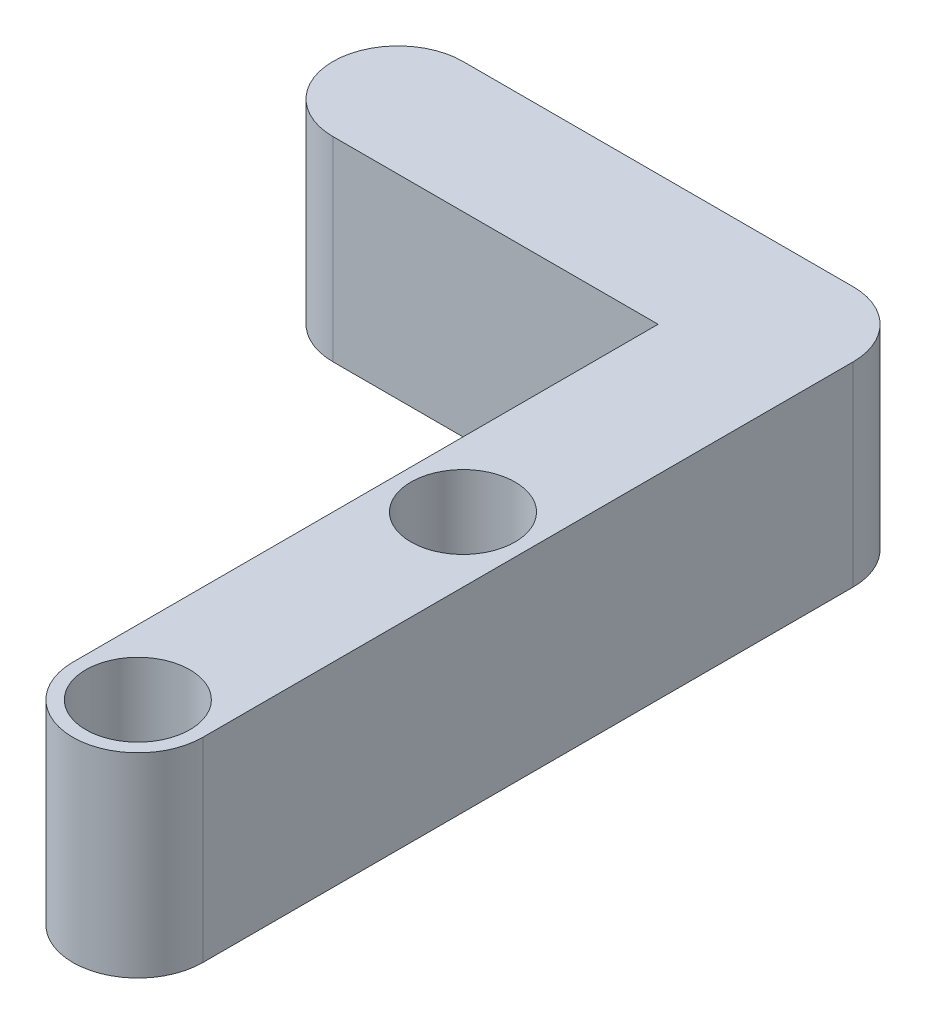
ISO-10303-21;
HEADER;
FILE_DESCRIPTION(('STEP AP214'),'2;1');
FILE_NAME('part.step','',(''),(''),'','','');
FILE_SCHEMA(('AUTOMOTIVE_DESIGN { 1 0 10303 214 1 1 1 1 }'));
ENDSEC;
DATA;
#1=APPLICATION_CONTEXT('core data for automotive mechanical design processes');
#2=APPLICATION_PROTOCOL_DEFINITION('international standard','automotive_design',2000,#1);
#3=PRODUCT_CONTEXT('',#1,'mechanical');
#4=PRODUCT('Part','Part','',(#3));
#5=PRODUCT_RELATED_PRODUCT_CATEGORY('part','',(#4));
#6=PRODUCT_DEFINITION_FORMATION('','',#4);
#7=PRODUCT_DEFINITION_CONTEXT('part definition',#1,'design');
#8=PRODUCT_DEFINITION('design','',#6,#7);
#9=PRODUCT_DEFINITION_SHAPE('','',#8);
#10=(LENGTH_UNIT() NAMED_UNIT(*) SI_UNIT(.MILLI.,.METRE.));
#11=(NAMED_UNIT(*) PLANE_ANGLE_UNIT() SI_UNIT($,.RADIAN.));
#12=(NAMED_UNIT(*) SI_UNIT($,.STERADIAN.) SOLID_ANGLE_UNIT());
#13=UNCERTAINTY_MEASURE_WITH_UNIT(LENGTH_MEASURE(1.E-05),#10,'distance_accuracy_value','');
#14=(GEOMETRIC_REPRESENTATION_CONTEXT(3) GLOBAL_UNCERTAINTY_ASSIGNED_CONTEXT((#13)) GLOBAL_UNIT_ASSIGNED_CONTEXT((#10,
#11,#12)) REPRESENTATION_CONTEXT('',''));
#15=CARTESIAN_POINT('',(0.,0.,0.));
#16=DIRECTION('',(0.,0.,1.));
#17=DIRECTION('',(1.,0.,0.));
#18=AXIS2_PLACEMENT_3D('',#15,#16,#17);
#19=CARTESIAN_POINT('',(-38.1229462191063,1.5,0.));
#20=DIRECTION('',(1.,0.,0.));
#21=DIRECTION('',(0.,0.,-1.));
#22=AXIS2_PLACEMENT_3D('',#19,#20,#21);
#23=PLANE('',#22);
#24=DIRECTION('',(0.,0.,1.));
#25=VECTOR('',#24,1.);
#26=CARTESIAN_POINT('',(-38.1229462191063,0.,0.));
#27=LINE('',#26,#25);
#28=CARTESIAN_POINT('',(-38.1229462191063,0.,14.3635639466581));
#29=VERTEX_POINT('',#28);
#30=CARTESIAN_POINT('',(-38.1229462191063,0.,19.3635639466581));
#31=VERTEX_POINT('',#30);
#32=EDGE_CURVE('E144',#29,#31,#27,.T.);
#33=ORIENTED_EDGE('',*,*,#32,.F.);
#34=DIRECTION('',(0.,-1.,0.));
#35=VECTOR('',#34,1.);
#36=CARTESIAN_POINT('',(-38.1229462191063,1.5,14.3635639466581));
#37=LINE('',#36,#35);
#38=CARTESIAN_POINT('',(-38.1229462191063,1.5,14.3635639466581));
#39=VERTEX_POINT('',#38);
#40=EDGE_CURVE('E11',#39,#29,#37,.T.);
#41=ORIENTED_EDGE('',*,*,#40,.F.);
#42=DIRECTION('',(0.,0.,1.));
#43=VECTOR('',#42,1.);
#44=CARTESIAN_POINT('',(-38.1229462191063,1.5,0.));
#45=LINE('',#44,#43);
#46=CARTESIAN_POINT('',(-38.1229462191063,1.5,19.3635639466581));
#47=VERTEX_POINT('',#46);
#48=EDGE_CURVE('E173',#39,#47,#45,.T.);
#49=ORIENTED_EDGE('',*,*,#48,.T.);
#50=DIRECTION('',(0.,-1.,0.));
#51=VECTOR('',#50,1.);
#52=CARTESIAN_POINT('',(-38.1229462191063,1.5,19.3635639466581));
#53=LINE('',#52,#51);
#54=EDGE_CURVE('E89',#47,#31,#53,.T.);
#55=ORIENTED_EDGE('',*,*,#54,.T.);
#56=EDGE_LOOP('',(#33,#41,#49,#55));
#57=FACE_BOUND('',#56,.T.);
#58=ADVANCED_FACE('F41',(#57),#23,.T.);
#59=CARTESIAN_POINT('',(-38.6229462191063,1.5,14.3635639466581));
#60=DIRECTION('',(0.,-1.,0.));
#61=DIRECTION('',(0.,0.,-1.));
#62=AXIS2_PLACEMENT_3D('',#59,#60,#61);
#63=CYLINDRICAL_SURFACE('',#62,0.5);
#64=CARTESIAN_POINT('',(-38.6229462191063,0.,14.3635639466581));
#65=DIRECTION('',(0.,1.,0.));
#66=DIRECTION('',(0.,0.,1.));
#67=AXIS2_PLACEMENT_3D('',#64,#65,#66);
#68=CIRCLE('',#67,0.5);
#69=CARTESIAN_POINT('',(-38.6229462191063,0.,13.8635639466581));
#70=VERTEX_POINT('',#69);
#71=EDGE_CURVE('E148',#29,#70,#68,.T.);
#72=ORIENTED_EDGE('',*,*,#71,.T.);
#73=DIRECTION('',(0.,-1.,0.));
#74=VECTOR('',#73,1.);
#75=CARTESIAN_POINT('',(-38.6229462191063,1.5,13.8635639466581));
#76=LINE('',#75,#74);
#77=CARTESIAN_POINT('',(-38.6229462191063,1.5,13.8635639466581));
#78=VERTEX_POINT('',#77);
#79=EDGE_CURVE('E50',#78,#70,#76,.T.);
#80=ORIENTED_EDGE('',*,*,#79,.F.);
#81=CARTESIAN_POINT('',(-38.6229462191063,1.5,14.3635639466581));
#82=DIRECTION('',(0.,1.,0.));
#83=DIRECTION('',(0.,0.,1.));
#84=AXIS2_PLACEMENT_3D('',#81,#82,#83);
#85=CIRCLE('',#84,0.5);
#86=EDGE_CURVE('E216',#39,#78,#85,.T.);
#87=ORIENTED_EDGE('',*,*,#86,.F.);
#88=ORIENTED_EDGE('',*,*,#40,.T.);
#89=EDGE_LOOP('',(#72,#80,#87,#88));
#90=FACE_BOUND('',#89,.T.);
#91=ADVANCED_FACE('F206',(#90),#63,.T.);
#92=CARTESIAN_POINT('',(0.,1.5,13.8635639466581));
#93=DIRECTION('',(0.,0.,1.));
#94=DIRECTION('',(1.,0.,0.));
#95=AXIS2_PLACEMENT_3D('',#92,#93,#94);
#96=PLANE('',#95);
#97=DIRECTION('',(-1.,0.,0.));
#98=VECTOR('',#97,1.);
#99=CARTESIAN_POINT('',(0.,0.,13.8635639466581));
#100=LINE('',#99,#98);
#101=CARTESIAN_POINT('',(-41.6229462191063,0.,13.8635639466581));
#102=VERTEX_POINT('',#101);
#103=EDGE_CURVE('E151',#70,#102,#100,.T.);
#104=ORIENTED_EDGE('',*,*,#103,.T.);
#105=DIRECTION('',(0.,-1.,0.));
#106=VECTOR('',#105,1.);
#107=CARTESIAN_POINT('',(-41.6229462191063,1.5,13.8635639466581));
#108=LINE('',#107,#106);
#109=CARTESIAN_POINT('',(-41.6229462191063,1.5,13.8635639466581));
#110=VERTEX_POINT('',#109);
#111=EDGE_CURVE('E180',#110,#102,#108,.T.);
#112=ORIENTED_EDGE('',*,*,#111,.F.);
#113=DIRECTION('',(-1.,0.,0.));
#114=VECTOR('',#113,1.);
#115=CARTESIAN_POINT('',(0.,1.5,13.8635639466581));
#116=LINE('',#115,#114);
#117=EDGE_CURVE('E130',#78,#110,#116,.T.);
#118=ORIENTED_EDGE('',*,*,#117,.F.);
#119=ORIENTED_EDGE('',*,*,#79,.T.);
#120=EDGE_LOOP('',(#104,#112,#118,#119));
#121=FACE_BOUND('',#120,.T.);
#122=ADVANCED_FACE('F189',(#121),#96,.F.);
#123=CARTESIAN_POINT('',(-41.6229462191063,1.5,14.3635639466581));
#124=DIRECTION('',(0.,-1.,0.));
#125=DIRECTION('',(0.,0.,-1.));
#126=AXIS2_PLACEMENT_3D('',#123,#124,#125);
#127=CYLINDRICAL_SURFACE('',#126,0.5);
#128=CARTESIAN_POINT('',(-41.6229462191063,0.,14.3635639466581));
#129=DIRECTION('',(0.,1.,0.));
#130=DIRECTION('',(0.,0.,1.));
#131=AXIS2_PLACEMENT_3D('',#128,#129,#130);
#132=CIRCLE('',#131,0.5);
#133=CARTESIAN_POINT('',(-41.6229462191063,0.,14.8635639466581));
#134=VERTEX_POINT('',#133);
#135=EDGE_CURVE('E154',#102,#134,#132,.T.);
#136=ORIENTED_EDGE('',*,*,#135,.T.);
#137=DIRECTION('',(0.,-1.,0.));
#138=VECTOR('',#137,1.);
#139=CARTESIAN_POINT('',(-41.6229462191063,1.5,14.8635639466581));
#140=LINE('',#139,#138);
#141=CARTESIAN_POINT('',(-41.6229462191063,1.5,14.8635639466581));
#142=VERTEX_POINT('',#141);
#143=EDGE_CURVE('E115',#142,#134,#140,.T.);
#144=ORIENTED_EDGE('',*,*,#143,.F.);
#145=CARTESIAN_POINT('',(-41.6229462191063,1.5,14.3635639466581));
#146=DIRECTION('',(0.,1.,0.));
#147=DIRECTION('',(0.,0.,1.));
#148=AXIS2_PLACEMENT_3D('',#145,#146,#147);
#149=CIRCLE('',#148,0.5);
#150=EDGE_CURVE('E125',#110,#142,#149,.T.);
#151=ORIENTED_EDGE('',*,*,#150,.F.);
#152=ORIENTED_EDGE('',*,*,#111,.T.);
#153=EDGE_LOOP('',(#136,#144,#151,#152));
#154=FACE_BOUND('',#153,.T.);
#155=ADVANCED_FACE('F198',(#154),#127,.T.);
#156=CARTESIAN_POINT('',(0.,1.5,14.8635639466581));
#157=DIRECTION('',(0.,0.,1.));
#158=DIRECTION('',(1.,0.,0.));
#159=AXIS2_PLACEMENT_3D('',#156,#157,#158);
#160=PLANE('',#159);
#161=DIRECTION('',(-1.,0.,0.));
#162=VECTOR('',#161,1.);
#163=CARTESIAN_POINT('',(0.,0.,14.8635639466581));
#164=LINE('',#163,#162);
#165=CARTESIAN_POINT('',(-39.1229462191063,0.,14.8635639466581));
#166=VERTEX_POINT('',#165);
#167=EDGE_CURVE('E113',#166,#134,#164,.T.);
#168=ORIENTED_EDGE('',*,*,#167,.F.);
#169=DIRECTION('',(0.,-1.,0.));
#170=VECTOR('',#169,1.);
#171=CARTESIAN_POINT('',(-39.1229462191063,1.5,14.8635639466581));
#172=LINE('',#171,#170);
#173=CARTESIAN_POINT('',(-39.1229462191063,1.5,14.8635639466581));
#174=VERTEX_POINT('',#173);
#175=EDGE_CURVE('E107',#174,#166,#172,.T.);
#176=ORIENTED_EDGE('',*,*,#175,.F.);
#177=DIRECTION('',(-1.,0.,0.));
#178=VECTOR('',#177,1.);
#179=CARTESIAN_POINT('',(0.,1.5,14.8635639466581));
#180=LINE('',#179,#178);
#181=EDGE_CURVE('E111',#174,#142,#180,.T.);
#182=ORIENTED_EDGE('',*,*,#181,.T.);
#183=ORIENTED_EDGE('',*,*,#143,.T.);
#184=EDGE_LOOP('',(#168,#176,#182,#183));
#185=FACE_BOUND('',#184,.T.);
#186=ADVANCED_FACE('F109',(#185),#160,.T.);
#187=CARTESIAN_POINT('',(-39.1229462191063,1.5,0.));
#188=DIRECTION('',(1.,0.,0.));
#189=DIRECTION('',(0.,0.,-1.));
#190=AXIS2_PLACEMENT_3D('',#187,#188,#189);
#191=PLANE('',#190);
#192=DIRECTION('',(0.,0.,1.));
#193=VECTOR('',#192,1.);
#194=CARTESIAN_POINT('',(-39.1229462191063,0.,0.));
#195=LINE('',#194,#193);
#196=CARTESIAN_POINT('',(-39.1229462191063,0.,19.3635639466581));
#197=VERTEX_POINT('',#196);
#198=EDGE_CURVE('E82',#166,#197,#195,.T.);
#199=ORIENTED_EDGE('',*,*,#198,.T.);
#200=DIRECTION('',(0.,-1.,0.));
#201=VECTOR('',#200,1.);
#202=CARTESIAN_POINT('',(-39.1229462191063,1.5,19.3635639466581));
#203=LINE('',#202,#201);
#204=CARTESIAN_POINT('',(-39.1229462191063,1.5,19.3635639466581));
#205=VERTEX_POINT('',#204);
#206=EDGE_CURVE('E116',#205,#197,#203,.T.);
#207=ORIENTED_EDGE('',*,*,#206,.F.);
#208=DIRECTION('',(0.,0.,1.));
#209=VECTOR('',#208,1.);
#210=CARTESIAN_POINT('',(-39.1229462191063,1.5,0.));
#211=LINE('',#210,#209);
#212=EDGE_CURVE('E118',#174,#205,#211,.T.);
#213=ORIENTED_EDGE('',*,*,#212,.F.);
#214=ORIENTED_EDGE('',*,*,#175,.T.);
#215=EDGE_LOOP('',(#199,#207,#213,#214));
#216=FACE_BOUND('',#215,.T.);
#217=ADVANCED_FACE('F119',(#216),#191,.F.);
#218=CARTESIAN_POINT('',(-38.6229462191063,1.5,16.8635639466581));
#219=DIRECTION('',(0.,-1.,0.));
#220=DIRECTION('',(0.,0.,-1.));
#221=AXIS2_PLACEMENT_3D('',#218,#219,#220);
#222=CYLINDRICAL_SURFACE('',#221,0.399999999999998);
#223=CARTESIAN_POINT('',(-38.6229462191063,1.5,16.8635639466581));
#224=DIRECTION('',(0.,1.,0.));
#225=DIRECTION('',(0.,0.,1.));
#226=AXIS2_PLACEMENT_3D('',#223,#224,#225);
#227=CIRCLE('',#226,0.399999999999998);
#228=CARTESIAN_POINT('',(-38.6229462191063,1.5,17.2635639466581));
#229=VERTEX_POINT('',#228);
#230=EDGE_CURVE('E136',#229,#229,#227,.T.);
#231=ORIENTED_EDGE('',*,*,#230,.T.);
#232=EDGE_LOOP('',(#231));
#233=FACE_BOUND('',#232,.T.);
#234=CARTESIAN_POINT('',(-38.6229462191063,0.,16.8635639466581));
#235=DIRECTION('',(0.,1.,0.));
#236=DIRECTION('',(0.,0.,1.));
#237=AXIS2_PLACEMENT_3D('',#234,#235,#236);
#238=CIRCLE('',#237,0.399999999999998);
#239=CARTESIAN_POINT('',(-38.6229462191063,0.,17.2635639466581));
#240=VERTEX_POINT('',#239);
#241=EDGE_CURVE('E165',#240,#240,#238,.T.);
#242=ORIENTED_EDGE('',*,*,#241,.F.);
#243=EDGE_LOOP('',(#242));
#244=FACE_BOUND('',#243,.T.);
#245=ADVANCED_FACE('F223',(#233,#244),#222,.F.);
#246=CARTESIAN_POINT('',(-38.6229462191063,1.5,19.3635639466581));
#247=DIRECTION('',(0.,-1.,0.));
#248=DIRECTION('',(0.,0.,-1.));
#249=AXIS2_PLACEMENT_3D('',#246,#247,#248);
#250=CYLINDRICAL_SURFACE('',#249,0.499999999999994);
#251=CARTESIAN_POINT('',(-38.6229462191063,0.,19.3635639466581));
#252=DIRECTION('',(0.,1.,0.));
#253=DIRECTION('',(0.,0.,1.));
#254=AXIS2_PLACEMENT_3D('',#251,#252,#253);
#255=CIRCLE('',#254,0.499999999999994);
#256=EDGE_CURVE('E162',#197,#31,#255,.T.);
#257=ORIENTED_EDGE('',*,*,#256,.T.);
#258=ORIENTED_EDGE('',*,*,#54,.F.);
#259=CARTESIAN_POINT('',(-38.6229462191063,1.5,19.3635639466581));
#260=DIRECTION('',(0.,1.,0.));
#261=DIRECTION('',(0.,0.,1.));
#262=AXIS2_PLACEMENT_3D('',#259,#260,#261);
#263=CIRCLE('',#262,0.499999999999994);
#264=EDGE_CURVE('E58',#205,#47,#263,.T.);
#265=ORIENTED_EDGE('',*,*,#264,.F.);
#266=ORIENTED_EDGE('',*,*,#206,.T.);
#267=EDGE_LOOP('',(#257,#258,#265,#266));
#268=FACE_BOUND('',#267,.T.);
#269=ADVANCED_FACE('F214',(#268),#250,.T.);
#270=CARTESIAN_POINT('',(-38.6229462191063,1.5,19.3635639466581));
#271=DIRECTION('',(0.,-1.,0.));
#272=DIRECTION('',(0.,0.,-1.));
#273=AXIS2_PLACEMENT_3D('',#270,#271,#272);
#274=CYLINDRICAL_SURFACE('',#273,0.399999999999998);
#275=CARTESIAN_POINT('',(-38.6229462191063,1.5,19.3635639466581));
#276=DIRECTION('',(0.,1.,0.));
#277=DIRECTION('',(0.,0.,1.));
#278=AXIS2_PLACEMENT_3D('',#275,#276,#277);
#279=CIRCLE('',#278,0.399999999999998);
#280=CARTESIAN_POINT('',(-38.6229462191063,1.5,19.7635639466581));
#281=VERTEX_POINT('',#280);
#282=EDGE_CURVE('E140',#281,#281,#279,.T.);
#283=ORIENTED_EDGE('',*,*,#282,.T.);
#284=EDGE_LOOP('',(#283));
#285=FACE_BOUND('',#284,.T.);
#286=CARTESIAN_POINT('',(-38.6229462191063,0.,19.3635639466581));
#287=DIRECTION('',(0.,1.,0.));
#288=DIRECTION('',(0.,0.,1.));
#289=AXIS2_PLACEMENT_3D('',#286,#287,#288);
#290=CIRCLE('',#289,0.399999999999998);
#291=CARTESIAN_POINT('',(-38.6229462191063,0.,19.7635639466581));
#292=VERTEX_POINT('',#291);
#293=EDGE_CURVE('E169',#292,#292,#290,.T.);
#294=ORIENTED_EDGE('',*,*,#293,.F.);
#295=EDGE_LOOP('',(#294));
#296=FACE_BOUND('',#295,.T.);
#297=ADVANCED_FACE('F222',(#285,#296),#274,.F.);
#298=CARTESIAN_POINT('',(0.,1.5,0.));
#299=DIRECTION('',(0.,1.,0.));
#300=DIRECTION('',(0.,0.,1.));
#301=AXIS2_PLACEMENT_3D('',#298,#299,#300);
#302=PLANE('',#301);
#303=ORIENTED_EDGE('',*,*,#48,.F.);
#304=ORIENTED_EDGE('',*,*,#86,.T.);
#305=ORIENTED_EDGE('',*,*,#117,.T.);
#306=ORIENTED_EDGE('',*,*,#150,.T.);
#307=ORIENTED_EDGE('',*,*,#181,.F.);
#308=ORIENTED_EDGE('',*,*,#212,.T.);
#309=ORIENTED_EDGE('',*,*,#264,.T.);
#310=EDGE_LOOP('',(#303,#304,#305,#306,#307,#308,#309));
#311=FACE_BOUND('',#310,.T.);
#312=ORIENTED_EDGE('',*,*,#230,.F.);
#313=EDGE_LOOP('',(#312));
#314=FACE_BOUND('',#313,.T.);
#315=ORIENTED_EDGE('',*,*,#282,.F.);
#316=EDGE_LOOP('',(#315));
#317=FACE_BOUND('',#316,.T.);
#318=ADVANCED_FACE('F122',(#311,#314,#317),#302,.T.);
#319=CARTESIAN_POINT('',(0.,0.,0.));
#320=DIRECTION('',(0.,1.,0.));
#321=DIRECTION('',(0.,0.,1.));
#322=AXIS2_PLACEMENT_3D('',#319,#320,#321);
#323=PLANE('',#322);
#324=ORIENTED_EDGE('',*,*,#32,.T.);
#325=ORIENTED_EDGE('',*,*,#256,.F.);
#326=ORIENTED_EDGE('',*,*,#198,.F.);
#327=ORIENTED_EDGE('',*,*,#167,.T.);
#328=ORIENTED_EDGE('',*,*,#135,.F.);
#329=ORIENTED_EDGE('',*,*,#103,.F.);
#330=ORIENTED_EDGE('',*,*,#71,.F.);
#331=EDGE_LOOP('',(#324,#325,#326,#327,#328,#329,#330));
#332=FACE_BOUND('',#331,.T.);
#333=ORIENTED_EDGE('',*,*,#241,.T.);
#334=EDGE_LOOP('',(#333));
#335=FACE_BOUND('',#334,.T.);
#336=ORIENTED_EDGE('',*,*,#293,.T.);
#337=EDGE_LOOP('',(#336));
#338=FACE_BOUND('',#337,.T.);
#339=ADVANCED_FACE('F195',(#332,#335,#338),#323,.F.);
#340=CLOSED_SHELL('',(#58,#91,#122,#155,#186,#217,#245,#269,#297,#318,#339));
#341=MANIFOLD_SOLID_BREP('B2',#340);
#342=ADVANCED_BREP_SHAPE_REPRESENTATION('',(#18,#341),#14);
#343=SHAPE_DEFINITION_REPRESENTATION(#9,#342);
ENDSEC;
END-ISO-10303-21;
